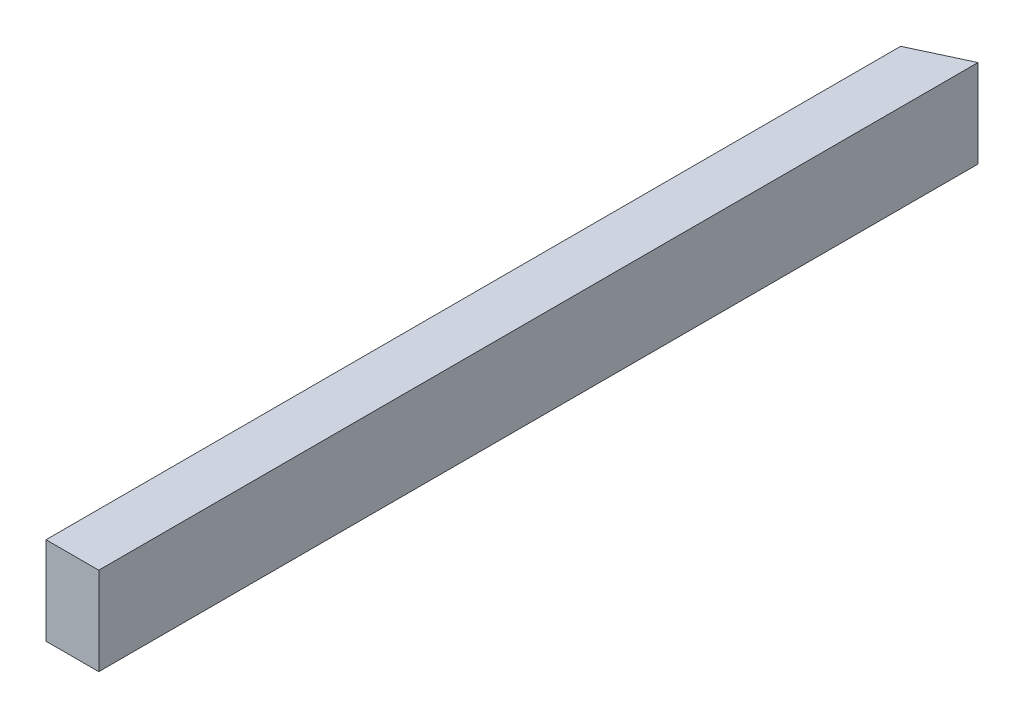
ISO-10303-21;
HEADER;
FILE_DESCRIPTION(('STEP AP214'),'2;1');
FILE_NAME('part.step','',(''),(''),'','','');
FILE_SCHEMA(('AUTOMOTIVE_DESIGN { 1 0 10303 214 1 1 1 1 }'));
ENDSEC;
DATA;
#1=APPLICATION_CONTEXT('core data for automotive mechanical design processes');
#2=APPLICATION_PROTOCOL_DEFINITION('international standard','automotive_design',2000,#1);
#3=PRODUCT_CONTEXT('',#1,'mechanical');
#4=PRODUCT('Part','Part','',(#3));
#5=PRODUCT_RELATED_PRODUCT_CATEGORY('part','',(#4));
#6=PRODUCT_DEFINITION_FORMATION('','',#4);
#7=PRODUCT_DEFINITION_CONTEXT('part definition',#1,'design');
#8=PRODUCT_DEFINITION('design','',#6,#7);
#9=PRODUCT_DEFINITION_SHAPE('','',#8);
#10=(LENGTH_UNIT() NAMED_UNIT(*) SI_UNIT(.MILLI.,.METRE.));
#11=(NAMED_UNIT(*) PLANE_ANGLE_UNIT() SI_UNIT($,.RADIAN.));
#12=(NAMED_UNIT(*) SI_UNIT($,.STERADIAN.) SOLID_ANGLE_UNIT());
#13=UNCERTAINTY_MEASURE_WITH_UNIT(LENGTH_MEASURE(1.E-05),#10,'distance_accuracy_value','');
#14=(GEOMETRIC_REPRESENTATION_CONTEXT(3) GLOBAL_UNCERTAINTY_ASSIGNED_CONTEXT((#13)) GLOBAL_UNIT_ASSIGNED_CONTEXT((#10,
#11,#12)) REPRESENTATION_CONTEXT('',''));
#15=CARTESIAN_POINT('',(0.,0.,0.));
#16=DIRECTION('',(0.,0.,1.));
#17=DIRECTION('',(1.,0.,0.));
#18=AXIS2_PLACEMENT_3D('',#15,#16,#17);
#19=CARTESIAN_POINT('',(-25.8587187266332,5.,-19.0367725418095));
#20=DIRECTION('',(-1.,0.,0.));
#21=DIRECTION('',(0.,0.,1.));
#22=AXIS2_PLACEMENT_3D('',#19,#20,#21);
#23=PLANE('',#22);
#24=DIRECTION('',(0.,0.,-1.));
#25=VECTOR('',#24,1.);
#26=CARTESIAN_POINT('',(-25.8587187266332,0.,-19.0367725418095));
#27=LINE('',#26,#25);
#28=CARTESIAN_POINT('',(-25.8587187266332,0.,30.9632274581905));
#29=VERTEX_POINT('',#28);
#30=CARTESIAN_POINT('',(-25.8587187266332,0.,-19.0367725418095));
#31=VERTEX_POINT('',#30);
#32=EDGE_CURVE('E100',#29,#31,#27,.T.);
#33=ORIENTED_EDGE('',*,*,#32,.T.);
#34=DIRECTION('',(0.,-1.,0.));
#35=VECTOR('',#34,1.);
#36=CARTESIAN_POINT('',(-25.8587187266332,5.,-19.0367725418095));
#37=LINE('',#36,#35);
#38=CARTESIAN_POINT('',(-25.8587187266332,5.,-19.0367725418095));
#39=VERTEX_POINT('',#38);
#40=EDGE_CURVE('E11',#39,#31,#37,.T.);
#41=ORIENTED_EDGE('',*,*,#40,.F.);
#42=DIRECTION('',(0.,0.,-1.));
#43=VECTOR('',#42,1.);
#44=CARTESIAN_POINT('',(-25.8587187266332,5.,-19.0367725418095));
#45=LINE('',#44,#43);
#46=CARTESIAN_POINT('',(-25.8587187266332,5.,30.9632274581905));
#47=VERTEX_POINT('',#46);
#48=EDGE_CURVE('E88',#47,#39,#45,.T.);
#49=ORIENTED_EDGE('',*,*,#48,.F.);
#50=DIRECTION('',(0.,-1.,0.));
#51=VECTOR('',#50,1.);
#52=CARTESIAN_POINT('',(-25.8587187266332,5.,30.9632274581905));
#53=LINE('',#52,#51);
#54=EDGE_CURVE('E96',#47,#29,#53,.T.);
#55=ORIENTED_EDGE('',*,*,#54,.T.);
#56=EDGE_LOOP('',(#33,#41,#49,#55));
#57=FACE_BOUND('',#56,.T.);
#58=ADVANCED_FACE('F37',(#57),#23,.F.);
#59=CARTESIAN_POINT('',(-25.8587187266332,5.,-19.0367725418095));
#60=DIRECTION('',(0.422618261740695,0.,0.906307787036652));
#61=DIRECTION('',(0.906307787036652,0.,-0.422618261740695));
#62=AXIS2_PLACEMENT_3D('',#59,#60,#61);
#63=PLANE('',#62);
#64=DIRECTION('',(-0.906307787036652,0.,0.422618261740695));
#65=VECTOR('',#64,1.);
#66=CARTESIAN_POINT('',(-25.8587187266332,0.,-19.0367725418095));
#67=LINE('',#66,#65);
#68=CARTESIAN_POINT('',(-28.8587187266332,0.,-17.6378495673445));
#69=VERTEX_POINT('',#68);
#70=EDGE_CURVE('E92',#31,#69,#67,.T.);
#71=ORIENTED_EDGE('',*,*,#70,.T.);
#72=DIRECTION('',(0.,-1.,0.));
#73=VECTOR('',#72,1.);
#74=CARTESIAN_POINT('',(-28.8587187266332,5.,-17.6378495673445));
#75=LINE('',#74,#73);
#76=CARTESIAN_POINT('',(-28.8587187266332,5.,-17.6378495673445));
#77=VERTEX_POINT('',#76);
#78=EDGE_CURVE('E45',#77,#69,#75,.T.);
#79=ORIENTED_EDGE('',*,*,#78,.F.);
#80=DIRECTION('',(-0.906307787036652,0.,0.422618261740695));
#81=VECTOR('',#80,1.);
#82=CARTESIAN_POINT('',(-25.8587187266332,5.,-19.0367725418095));
#83=LINE('',#82,#81);
#84=EDGE_CURVE('E83',#39,#77,#83,.T.);
#85=ORIENTED_EDGE('',*,*,#84,.F.);
#86=ORIENTED_EDGE('',*,*,#40,.T.);
#87=EDGE_LOOP('',(#71,#79,#85,#86));
#88=FACE_BOUND('',#87,.T.);
#89=ADVANCED_FACE('F91',(#88),#63,.F.);
#90=CARTESIAN_POINT('',(-28.8587187266332,5.,-17.6378495673445));
#91=DIRECTION('',(1.,0.,0.));
#92=DIRECTION('',(0.,0.,-1.));
#93=AXIS2_PLACEMENT_3D('',#90,#91,#92);
#94=PLANE('',#93);
#95=DIRECTION('',(0.,0.,1.));
#96=VECTOR('',#95,1.);
#97=CARTESIAN_POINT('',(-28.8587187266332,0.,-17.6378495673445));
#98=LINE('',#97,#96);
#99=CARTESIAN_POINT('',(-28.8587187266332,0.,30.9632274581905));
#100=VERTEX_POINT('',#99);
#101=EDGE_CURVE('E70',#69,#100,#98,.T.);
#102=ORIENTED_EDGE('',*,*,#101,.T.);
#103=DIRECTION('',(0.,-1.,0.));
#104=VECTOR('',#103,1.);
#105=CARTESIAN_POINT('',(-28.8587187266332,5.,30.9632274581905));
#106=LINE('',#105,#104);
#107=CARTESIAN_POINT('',(-28.8587187266332,5.,30.9632274581905));
#108=VERTEX_POINT('',#107);
#109=EDGE_CURVE('E93',#108,#100,#106,.T.);
#110=ORIENTED_EDGE('',*,*,#109,.F.);
#111=DIRECTION('',(0.,0.,1.));
#112=VECTOR('',#111,1.);
#113=CARTESIAN_POINT('',(-28.8587187266332,5.,-17.6378495673445));
#114=LINE('',#113,#112);
#115=EDGE_CURVE('E86',#77,#108,#114,.T.);
#116=ORIENTED_EDGE('',*,*,#115,.F.);
#117=ORIENTED_EDGE('',*,*,#78,.T.);
#118=EDGE_LOOP('',(#102,#110,#116,#117));
#119=FACE_BOUND('',#118,.T.);
#120=ADVANCED_FACE('F94',(#119),#94,.F.);
#121=CARTESIAN_POINT('',(-28.8587187266332,5.,30.9632274581905));
#122=DIRECTION('',(0.,0.,-1.));
#123=DIRECTION('',(-1.,0.,0.));
#124=AXIS2_PLACEMENT_3D('',#121,#122,#123);
#125=PLANE('',#124);
#126=DIRECTION('',(1.,0.,0.));
#127=VECTOR('',#126,1.);
#128=CARTESIAN_POINT('',(-28.8587187266332,0.,30.9632274581905));
#129=LINE('',#128,#127);
#130=EDGE_CURVE('E76',#100,#29,#129,.T.);
#131=ORIENTED_EDGE('',*,*,#130,.T.);
#132=ORIENTED_EDGE('',*,*,#54,.F.);
#133=DIRECTION('',(1.,0.,0.));
#134=VECTOR('',#133,1.);
#135=CARTESIAN_POINT('',(-28.8587187266332,5.,30.9632274581905));
#136=LINE('',#135,#134);
#137=EDGE_CURVE('E53',#108,#47,#136,.T.);
#138=ORIENTED_EDGE('',*,*,#137,.F.);
#139=ORIENTED_EDGE('',*,*,#109,.T.);
#140=EDGE_LOOP('',(#131,#132,#138,#139));
#141=FACE_BOUND('',#140,.T.);
#142=ADVANCED_FACE('F107',(#141),#125,.F.);
#143=CARTESIAN_POINT('',(0.,5.,0.));
#144=DIRECTION('',(0.,1.,0.));
#145=DIRECTION('',(0.,0.,1.));
#146=AXIS2_PLACEMENT_3D('',#143,#144,#145);
#147=PLANE('',#146);
#148=ORIENTED_EDGE('',*,*,#48,.T.);
#149=ORIENTED_EDGE('',*,*,#84,.T.);
#150=ORIENTED_EDGE('',*,*,#115,.T.);
#151=ORIENTED_EDGE('',*,*,#137,.T.);
#152=EDGE_LOOP('',(#148,#149,#150,#151));
#153=FACE_BOUND('',#152,.T.);
#154=ADVANCED_FACE('F84',(#153),#147,.T.);
#155=CARTESIAN_POINT('',(0.,0.,0.));
#156=DIRECTION('',(0.,1.,0.));
#157=DIRECTION('',(0.,0.,1.));
#158=AXIS2_PLACEMENT_3D('',#155,#156,#157);
#159=PLANE('',#158);
#160=ORIENTED_EDGE('',*,*,#32,.F.);
#161=ORIENTED_EDGE('',*,*,#130,.F.);
#162=ORIENTED_EDGE('',*,*,#101,.F.);
#163=ORIENTED_EDGE('',*,*,#70,.F.);
#164=EDGE_LOOP('',(#160,#161,#162,#163));
#165=FACE_BOUND('',#164,.T.);
#166=ADVANCED_FACE('F110',(#165),#159,.F.);
#167=CLOSED_SHELL('',(#58,#89,#120,#142,#154,#166));
#168=MANIFOLD_SOLID_BREP('B2',#167);
#169=ADVANCED_BREP_SHAPE_REPRESENTATION('',(#18,#168),#14);
#170=SHAPE_DEFINITION_REPRESENTATION(#9,#169);
ENDSEC;
END-ISO-10303-21;
